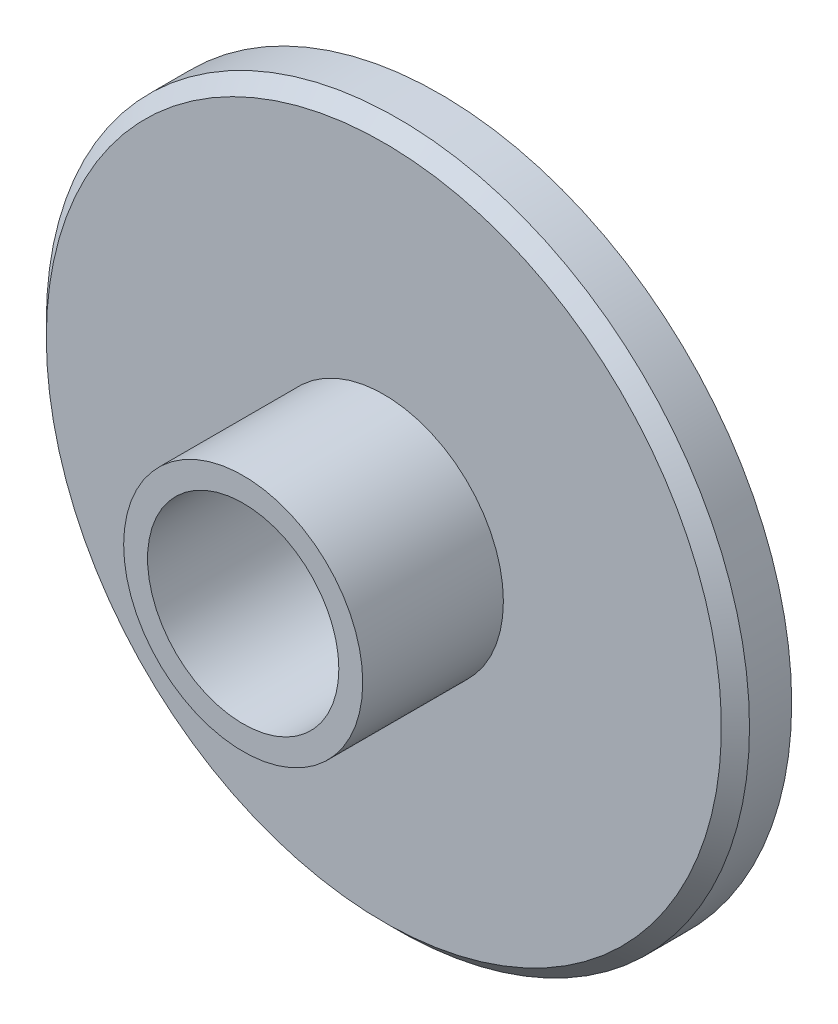
ISO-10303-21;
HEADER;
FILE_DESCRIPTION(('STEP AP214'),'2;1');
FILE_NAME('part.step','',(''),(''),'','','');
FILE_SCHEMA(('AUTOMOTIVE_DESIGN { 1 0 10303 214 1 1 1 1 }'));
ENDSEC;
DATA;
#1=APPLICATION_CONTEXT('core data for automotive mechanical design processes');
#2=APPLICATION_PROTOCOL_DEFINITION('international standard','automotive_design',2000,#1);
#3=PRODUCT_CONTEXT('',#1,'mechanical');
#4=PRODUCT('Part','Part','',(#3));
#5=PRODUCT_RELATED_PRODUCT_CATEGORY('part','',(#4));
#6=PRODUCT_DEFINITION_FORMATION('','',#4);
#7=PRODUCT_DEFINITION_CONTEXT('part definition',#1,'design');
#8=PRODUCT_DEFINITION('design','',#6,#7);
#9=PRODUCT_DEFINITION_SHAPE('','',#8);
#10=(LENGTH_UNIT() NAMED_UNIT(*) SI_UNIT(.MILLI.,.METRE.));
#11=(NAMED_UNIT(*) PLANE_ANGLE_UNIT() SI_UNIT($,.RADIAN.));
#12=(NAMED_UNIT(*) SI_UNIT($,.STERADIAN.) SOLID_ANGLE_UNIT());
#13=UNCERTAINTY_MEASURE_WITH_UNIT(LENGTH_MEASURE(1.E-05),#10,'distance_accuracy_value','');
#14=(GEOMETRIC_REPRESENTATION_CONTEXT(3) GLOBAL_UNCERTAINTY_ASSIGNED_CONTEXT((#13)) GLOBAL_UNIT_ASSIGNED_CONTEXT((#10,
#11,#12)) REPRESENTATION_CONTEXT('',''));
#15=CARTESIAN_POINT('',(0.,0.,0.));
#16=DIRECTION('',(0.,0.,1.));
#17=DIRECTION('',(1.,0.,0.));
#18=AXIS2_PLACEMENT_3D('',#15,#16,#17);
#19=CARTESIAN_POINT('',(0.,0.,0.));
#20=DIRECTION('',(0.,0.,1.));
#21=DIRECTION('',(1.,0.,0.));
#22=AXIS2_PLACEMENT_3D('',#19,#20,#21);
#23=CYLINDRICAL_SURFACE('',#22,3.4);
#24=CARTESIAN_POINT('',(0.,0.,-5.2));
#25=DIRECTION('',(0.,0.,1.));
#26=DIRECTION('',(1.,0.,0.));
#27=AXIS2_PLACEMENT_3D('',#24,#25,#26);
#28=CIRCLE('',#27,3.4);
#29=CARTESIAN_POINT('',(3.4,0.,-5.2));
#30=VERTEX_POINT('',#29);
#31=EDGE_CURVE('E91',#30,#30,#28,.T.);
#32=ORIENTED_EDGE('',*,*,#31,.F.);
#33=EDGE_LOOP('',(#32));
#34=FACE_BOUND('',#33,.T.);
#35=CARTESIAN_POINT('',(0.,0.,0.));
#36=DIRECTION('',(0.,0.,1.));
#37=DIRECTION('',(1.,0.,0.));
#38=AXIS2_PLACEMENT_3D('',#35,#36,#37);
#39=CIRCLE('',#38,3.4);
#40=CARTESIAN_POINT('',(3.4,0.,0.));
#41=VERTEX_POINT('',#40);
#42=EDGE_CURVE('E46',#41,#41,#39,.T.);
#43=ORIENTED_EDGE('',*,*,#42,.T.);
#44=EDGE_LOOP('',(#43));
#45=FACE_BOUND('',#44,.T.);
#46=ADVANCED_FACE('F35',(#34,#45),#23,.F.);
#47=CARTESIAN_POINT('',(0.,3.4,0.));
#48=DIRECTION('',(0.,0.,-1.));
#49=DIRECTION('',(-1.,0.,0.));
#50=AXIS2_PLACEMENT_3D('',#47,#48,#49);
#51=PLANE('',#50);
#52=ORIENTED_EDGE('',*,*,#42,.F.);
#53=EDGE_LOOP('',(#52));
#54=FACE_BOUND('',#53,.T.);
#55=CARTESIAN_POINT('',(0.,0.,0.));
#56=DIRECTION('',(0.,0.,1.));
#57=DIRECTION('',(1.,0.,0.));
#58=AXIS2_PLACEMENT_3D('',#55,#56,#57);
#59=CIRCLE('',#58,4.25);
#60=CARTESIAN_POINT('',(4.25,0.,0.));
#61=VERTEX_POINT('',#60);
#62=EDGE_CURVE('E50',#61,#61,#59,.T.);
#63=ORIENTED_EDGE('',*,*,#62,.T.);
#64=EDGE_LOOP('',(#63));
#65=FACE_BOUND('',#64,.T.);
#66=ADVANCED_FACE('F99',(#54,#65),#51,.F.);
#67=CARTESIAN_POINT('',(0.,0.,0.));
#68=DIRECTION('',(0.,0.,1.));
#69=DIRECTION('',(1.,0.,0.));
#70=AXIS2_PLACEMENT_3D('',#67,#68,#69);
#71=CYLINDRICAL_SURFACE('',#70,4.25);
#72=ORIENTED_EDGE('',*,*,#62,.F.);
#73=EDGE_LOOP('',(#72));
#74=FACE_BOUND('',#73,.T.);
#75=CARTESIAN_POINT('',(0.,0.,-5.));
#76=DIRECTION('',(0.,0.,1.));
#77=DIRECTION('',(1.,0.,0.));
#78=AXIS2_PLACEMENT_3D('',#75,#76,#77);
#79=CIRCLE('',#78,4.25);
#80=CARTESIAN_POINT('',(4.25,0.,-5.));
#81=VERTEX_POINT('',#80);
#82=EDGE_CURVE('E55',#81,#81,#79,.T.);
#83=ORIENTED_EDGE('',*,*,#82,.T.);
#84=EDGE_LOOP('',(#83));
#85=FACE_BOUND('',#84,.T.);
#86=ADVANCED_FACE('F104',(#74,#85),#71,.T.);
#87=CARTESIAN_POINT('',(0.,4.25,-5.));
#88=DIRECTION('',(0.,0.,-1.));
#89=DIRECTION('',(-1.,0.,0.));
#90=AXIS2_PLACEMENT_3D('',#87,#88,#89);
#91=PLANE('',#90);
#92=CARTESIAN_POINT('',(0.,0.,-5.));
#93=DIRECTION('',(0.,0.,-1.));
#94=DIRECTION('',(-1.,0.,0.));
#95=AXIS2_PLACEMENT_3D('',#92,#93,#94);
#96=CIRCLE('',#95,12.);
#97=CARTESIAN_POINT('',(-12.,0.,-5.));
#98=VERTEX_POINT('',#97);
#99=EDGE_CURVE('E42',#98,#98,#96,.F.);
#100=ORIENTED_EDGE('',*,*,#99,.T.);
#101=EDGE_LOOP('',(#100));
#102=FACE_BOUND('',#101,.T.);
#103=ORIENTED_EDGE('',*,*,#82,.F.);
#104=EDGE_LOOP('',(#103));
#105=FACE_BOUND('',#104,.T.);
#106=ADVANCED_FACE('F110',(#102,#105),#91,.F.);
#107=CARTESIAN_POINT('',(0.,0.,0.));
#108=DIRECTION('',(0.,0.,1.));
#109=DIRECTION('',(1.,0.,0.));
#110=AXIS2_PLACEMENT_3D('',#107,#108,#109);
#111=CYLINDRICAL_SURFACE('',#110,12.5);
#112=CARTESIAN_POINT('',(0.,0.,-5.49999999999999));
#113=DIRECTION('',(0.,0.,-1.));
#114=DIRECTION('',(-1.,0.,0.));
#115=AXIS2_PLACEMENT_3D('',#112,#113,#114);
#116=CIRCLE('',#115,12.5);
#117=CARTESIAN_POINT('',(-12.5,0.,-5.49999999999999));
#118=VERTEX_POINT('',#117);
#119=EDGE_CURVE('E10',#118,#118,#116,.T.);
#120=ORIENTED_EDGE('',*,*,#119,.T.);
#121=EDGE_LOOP('',(#120));
#122=FACE_BOUND('',#121,.T.);
#123=CARTESIAN_POINT('',(0.,0.,-7.));
#124=DIRECTION('',(0.,0.,1.));
#125=DIRECTION('',(1.,0.,0.));
#126=AXIS2_PLACEMENT_3D('',#123,#124,#125);
#127=CIRCLE('',#126,12.5);
#128=CARTESIAN_POINT('',(12.5,0.,-7.));
#129=VERTEX_POINT('',#128);
#130=EDGE_CURVE('E58',#129,#129,#127,.T.);
#131=ORIENTED_EDGE('',*,*,#130,.T.);
#132=EDGE_LOOP('',(#131));
#133=FACE_BOUND('',#132,.T.);
#134=ADVANCED_FACE('F115',(#122,#133),#111,.T.);
#135=CARTESIAN_POINT('',(0.,12.5,-7.));
#136=DIRECTION('',(0.,0.,1.));
#137=DIRECTION('',(1.,0.,0.));
#138=AXIS2_PLACEMENT_3D('',#135,#136,#137);
#139=PLANE('',#138);
#140=ORIENTED_EDGE('',*,*,#130,.F.);
#141=EDGE_LOOP('',(#140));
#142=FACE_BOUND('',#141,.T.);
#143=CARTESIAN_POINT('',(0.,0.,-7.));
#144=DIRECTION('',(0.,0.,1.));
#145=DIRECTION('',(1.,0.,0.));
#146=AXIS2_PLACEMENT_3D('',#143,#144,#145);
#147=CIRCLE('',#146,10.6);
#148=CARTESIAN_POINT('',(10.6,0.,-7.));
#149=VERTEX_POINT('',#148);
#150=EDGE_CURVE('E61',#149,#149,#147,.T.);
#151=ORIENTED_EDGE('',*,*,#150,.T.);
#152=EDGE_LOOP('',(#151));
#153=FACE_BOUND('',#152,.T.);
#154=ADVANCED_FACE('F120',(#142,#153),#139,.F.);
#155=CARTESIAN_POINT('',(0.,0.,0.));
#156=DIRECTION('',(0.,0.,1.));
#157=DIRECTION('',(1.,0.,0.));
#158=AXIS2_PLACEMENT_3D('',#155,#156,#157);
#159=CYLINDRICAL_SURFACE('',#158,10.6);
#160=ORIENTED_EDGE('',*,*,#150,.F.);
#161=EDGE_LOOP('',(#160));
#162=FACE_BOUND('',#161,.T.);
#163=CARTESIAN_POINT('',(0.,0.,-6.));
#164=DIRECTION('',(0.,0.,1.));
#165=DIRECTION('',(1.,0.,0.));
#166=AXIS2_PLACEMENT_3D('',#163,#164,#165);
#167=CIRCLE('',#166,10.6);
#168=CARTESIAN_POINT('',(10.6,0.,-6.));
#169=VERTEX_POINT('',#168);
#170=EDGE_CURVE('E64',#169,#169,#167,.T.);
#171=ORIENTED_EDGE('',*,*,#170,.T.);
#172=EDGE_LOOP('',(#171));
#173=FACE_BOUND('',#172,.T.);
#174=ADVANCED_FACE('F125',(#162,#173),#159,.F.);
#175=CARTESIAN_POINT('',(0.,10.6,-6.));
#176=DIRECTION('',(0.,0.,1.));
#177=DIRECTION('',(1.,0.,0.));
#178=AXIS2_PLACEMENT_3D('',#175,#176,#177);
#179=PLANE('',#178);
#180=ORIENTED_EDGE('',*,*,#170,.F.);
#181=EDGE_LOOP('',(#180));
#182=FACE_BOUND('',#181,.T.);
#183=CARTESIAN_POINT('',(0.,0.,-6.));
#184=DIRECTION('',(0.,0.,1.));
#185=DIRECTION('',(1.,0.,0.));
#186=AXIS2_PLACEMENT_3D('',#183,#184,#185);
#187=CIRCLE('',#186,7.9);
#188=CARTESIAN_POINT('',(7.9,0.,-6.));
#189=VERTEX_POINT('',#188);
#190=EDGE_CURVE('E67',#189,#189,#187,.T.);
#191=ORIENTED_EDGE('',*,*,#190,.T.);
#192=EDGE_LOOP('',(#191));
#193=FACE_BOUND('',#192,.T.);
#194=ADVANCED_FACE('F129',(#182,#193),#179,.F.);
#195=CARTESIAN_POINT('',(0.,0.,0.));
#196=DIRECTION('',(0.,0.,1.));
#197=DIRECTION('',(1.,0.,0.));
#198=AXIS2_PLACEMENT_3D('',#195,#196,#197);
#199=CYLINDRICAL_SURFACE('',#198,7.9);
#200=ORIENTED_EDGE('',*,*,#190,.F.);
#201=EDGE_LOOP('',(#200));
#202=FACE_BOUND('',#201,.T.);
#203=CARTESIAN_POINT('',(0.,0.,-7.));
#204=DIRECTION('',(0.,0.,1.));
#205=DIRECTION('',(1.,0.,0.));
#206=AXIS2_PLACEMENT_3D('',#203,#204,#205);
#207=CIRCLE('',#206,7.9);
#208=CARTESIAN_POINT('',(7.9,0.,-7.));
#209=VERTEX_POINT('',#208);
#210=EDGE_CURVE('E70',#209,#209,#207,.T.);
#211=ORIENTED_EDGE('',*,*,#210,.T.);
#212=EDGE_LOOP('',(#211));
#213=FACE_BOUND('',#212,.T.);
#214=ADVANCED_FACE('F133',(#202,#213),#199,.T.);
#215=CARTESIAN_POINT('',(0.,7.9,-7.));
#216=DIRECTION('',(0.,0.,1.));
#217=DIRECTION('',(1.,0.,0.));
#218=AXIS2_PLACEMENT_3D('',#215,#216,#217);
#219=PLANE('',#218);
#220=ORIENTED_EDGE('',*,*,#210,.F.);
#221=EDGE_LOOP('',(#220));
#222=FACE_BOUND('',#221,.T.);
#223=CARTESIAN_POINT('',(0.,0.,-7.));
#224=DIRECTION('',(0.,0.,1.));
#225=DIRECTION('',(1.,0.,0.));
#226=AXIS2_PLACEMENT_3D('',#223,#224,#225);
#227=CIRCLE('',#226,4.75);
#228=CARTESIAN_POINT('',(4.75,0.,-7.));
#229=VERTEX_POINT('',#228);
#230=EDGE_CURVE('E73',#229,#229,#227,.T.);
#231=ORIENTED_EDGE('',*,*,#230,.T.);
#232=EDGE_LOOP('',(#231));
#233=FACE_BOUND('',#232,.T.);
#234=ADVANCED_FACE('F137',(#222,#233),#219,.F.);
#235=CARTESIAN_POINT('',(0.,0.,0.));
#236=DIRECTION('',(0.,0.,1.));
#237=DIRECTION('',(1.,0.,0.));
#238=AXIS2_PLACEMENT_3D('',#235,#236,#237);
#239=CYLINDRICAL_SURFACE('',#238,4.75);
#240=ORIENTED_EDGE('',*,*,#230,.F.);
#241=EDGE_LOOP('',(#240));
#242=FACE_BOUND('',#241,.T.);
#243=CARTESIAN_POINT('',(0.,0.,-8.2));
#244=DIRECTION('',(0.,0.,1.));
#245=DIRECTION('',(1.,0.,0.));
#246=AXIS2_PLACEMENT_3D('',#243,#244,#245);
#247=CIRCLE('',#246,4.75);
#248=CARTESIAN_POINT('',(4.75,0.,-8.2));
#249=VERTEX_POINT('',#248);
#250=EDGE_CURVE('E76',#249,#249,#247,.T.);
#251=ORIENTED_EDGE('',*,*,#250,.T.);
#252=EDGE_LOOP('',(#251));
#253=FACE_BOUND('',#252,.T.);
#254=ADVANCED_FACE('F141',(#242,#253),#239,.T.);
#255=CARTESIAN_POINT('',(0.,4.75,-8.2));
#256=DIRECTION('',(0.,0.,1.));
#257=DIRECTION('',(1.,0.,0.));
#258=AXIS2_PLACEMENT_3D('',#255,#256,#257);
#259=PLANE('',#258);
#260=ORIENTED_EDGE('',*,*,#250,.F.);
#261=EDGE_LOOP('',(#260));
#262=FACE_BOUND('',#261,.T.);
#263=CARTESIAN_POINT('',(0.,0.,-8.2));
#264=DIRECTION('',(0.,0.,1.));
#265=DIRECTION('',(1.,0.,0.));
#266=AXIS2_PLACEMENT_3D('',#263,#264,#265);
#267=CIRCLE('',#266,4.);
#268=CARTESIAN_POINT('',(4.,0.,-8.2));
#269=VERTEX_POINT('',#268);
#270=EDGE_CURVE('E79',#269,#269,#267,.T.);
#271=ORIENTED_EDGE('',*,*,#270,.T.);
#272=EDGE_LOOP('',(#271));
#273=FACE_BOUND('',#272,.T.);
#274=ADVANCED_FACE('F145',(#262,#273),#259,.F.);
#275=CARTESIAN_POINT('',(0.,0.,0.));
#276=DIRECTION('',(0.,0.,1.));
#277=DIRECTION('',(1.,0.,0.));
#278=AXIS2_PLACEMENT_3D('',#275,#276,#277);
#279=CYLINDRICAL_SURFACE('',#278,4.);
#280=ORIENTED_EDGE('',*,*,#270,.F.);
#281=EDGE_LOOP('',(#280));
#282=FACE_BOUND('',#281,.T.);
#283=CARTESIAN_POINT('',(0.,0.,-8.5));
#284=DIRECTION('',(0.,0.,1.));
#285=DIRECTION('',(1.,0.,0.));
#286=AXIS2_PLACEMENT_3D('',#283,#284,#285);
#287=CIRCLE('',#286,4.);
#288=CARTESIAN_POINT('',(4.,0.,-8.5));
#289=VERTEX_POINT('',#288);
#290=EDGE_CURVE('E82',#289,#289,#287,.T.);
#291=ORIENTED_EDGE('',*,*,#290,.T.);
#292=EDGE_LOOP('',(#291));
#293=FACE_BOUND('',#292,.T.);
#294=ADVANCED_FACE('F149',(#282,#293),#279,.T.);
#295=CARTESIAN_POINT('',(0.,4.,-8.5));
#296=DIRECTION('',(0.,0.,1.));
#297=DIRECTION('',(1.,0.,0.));
#298=AXIS2_PLACEMENT_3D('',#295,#296,#297);
#299=PLANE('',#298);
#300=ORIENTED_EDGE('',*,*,#290,.F.);
#301=EDGE_LOOP('',(#300));
#302=FACE_BOUND('',#301,.T.);
#303=CARTESIAN_POINT('',(0.,0.,-8.5));
#304=DIRECTION('',(0.,0.,1.));
#305=DIRECTION('',(1.,0.,0.));
#306=AXIS2_PLACEMENT_3D('',#303,#304,#305);
#307=CIRCLE('',#306,3.1);
#308=CARTESIAN_POINT('',(3.1,0.,-8.5));
#309=VERTEX_POINT('',#308);
#310=EDGE_CURVE('E85',#309,#309,#307,.T.);
#311=ORIENTED_EDGE('',*,*,#310,.T.);
#312=EDGE_LOOP('',(#311));
#313=FACE_BOUND('',#312,.T.);
#314=ADVANCED_FACE('F153',(#302,#313),#299,.F.);
#315=CARTESIAN_POINT('',(0.,0.,0.));
#316=DIRECTION('',(0.,0.,1.));
#317=DIRECTION('',(1.,0.,0.));
#318=AXIS2_PLACEMENT_3D('',#315,#316,#317);
#319=CYLINDRICAL_SURFACE('',#318,3.1);
#320=ORIENTED_EDGE('',*,*,#310,.F.);
#321=EDGE_LOOP('',(#320));
#322=FACE_BOUND('',#321,.T.);
#323=CARTESIAN_POINT('',(0.,0.,-5.2));
#324=DIRECTION('',(0.,0.,1.));
#325=DIRECTION('',(1.,0.,0.));
#326=AXIS2_PLACEMENT_3D('',#323,#324,#325);
#327=CIRCLE('',#326,3.1);
#328=CARTESIAN_POINT('',(3.1,0.,-5.2));
#329=VERTEX_POINT('',#328);
#330=EDGE_CURVE('E88',#329,#329,#327,.T.);
#331=ORIENTED_EDGE('',*,*,#330,.T.);
#332=EDGE_LOOP('',(#331));
#333=FACE_BOUND('',#332,.T.);
#334=ADVANCED_FACE('F157',(#322,#333),#319,.F.);
#335=CARTESIAN_POINT('',(0.,3.4,-5.2));
#336=DIRECTION('',(0.,0.,-1.));
#337=DIRECTION('',(-1.,0.,0.));
#338=AXIS2_PLACEMENT_3D('',#335,#336,#337);
#339=PLANE('',#338);
#340=ORIENTED_EDGE('',*,*,#330,.F.);
#341=EDGE_LOOP('',(#340));
#342=FACE_BOUND('',#341,.T.);
#343=ORIENTED_EDGE('',*,*,#31,.T.);
#344=EDGE_LOOP('',(#343));
#345=FACE_BOUND('',#344,.T.);
#346=ADVANCED_FACE('F95',(#342,#345),#339,.F.);
#347=CARTESIAN_POINT('',(0.,0.,-5.));
#348=DIRECTION('',(0.,0.,-1.));
#349=DIRECTION('',(-1.,0.,0.));
#350=AXIS2_PLACEMENT_3D('',#347,#348,#349);
#351=CONICAL_SURFACE('',#350,12.,0.785398163397447);
#352=ORIENTED_EDGE('',*,*,#119,.F.);
#353=EDGE_LOOP('',(#352));
#354=FACE_BOUND('',#353,.T.);
#355=ORIENTED_EDGE('',*,*,#99,.F.);
#356=EDGE_LOOP('',(#355));
#357=FACE_BOUND('',#356,.T.);
#358=ADVANCED_FACE('F37',(#354,#357),#351,.T.);
#359=CLOSED_SHELL('',(#46,#66,#86,#106,#134,#154,#174,#194,#214,#234,#254,#274,#294,#314,#334,
#346,#358));
#360=MANIFOLD_SOLID_BREP('B2',#359);
#361=ADVANCED_BREP_SHAPE_REPRESENTATION('',(#18,#360),#14);
#362=SHAPE_DEFINITION_REPRESENTATION(#9,#361);
ENDSEC;
END-ISO-10303-21;
